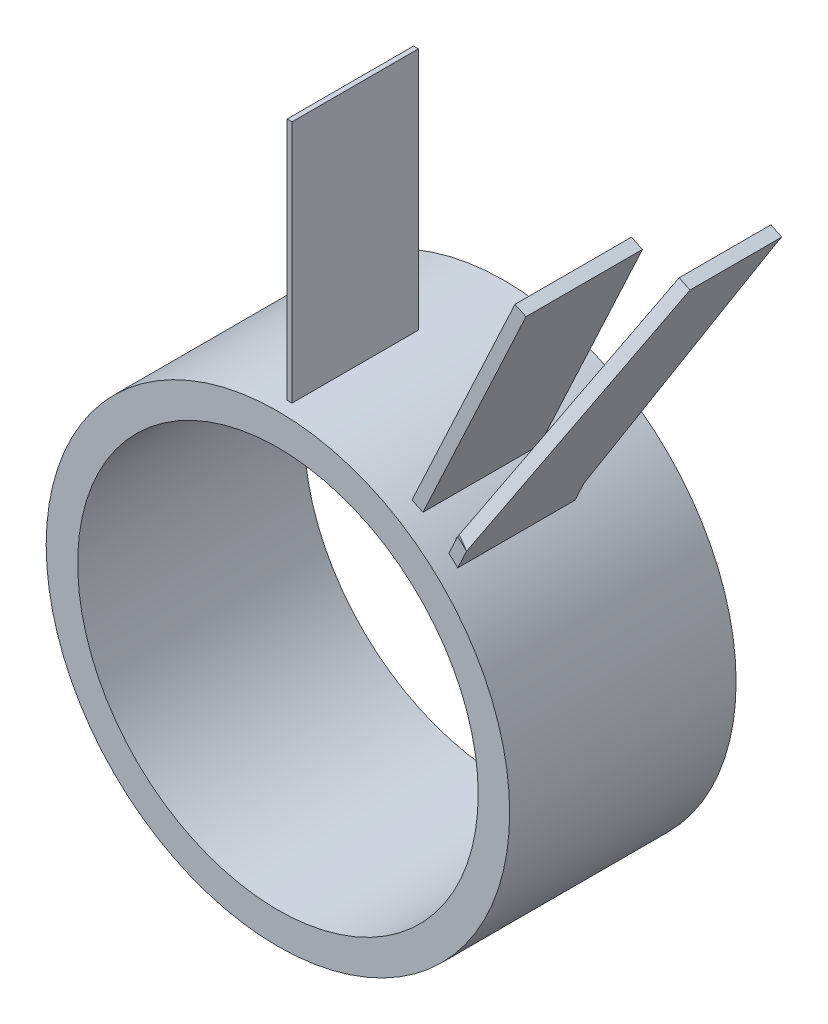
ISO-10303-21;
HEADER;
FILE_DESCRIPTION(('STEP AP214'),'2;1');
FILE_NAME('part.step','',(''),(''),'','','');
FILE_SCHEMA(('AUTOMOTIVE_DESIGN { 1 0 10303 214 1 1 1 1 }'));
ENDSEC;
DATA;
#1=APPLICATION_CONTEXT('core data for automotive mechanical design processes');
#2=APPLICATION_PROTOCOL_DEFINITION('international standard','automotive_design',2000,#1);
#3=PRODUCT_CONTEXT('',#1,'mechanical');
#4=PRODUCT('Part','Part','',(#3));
#5=PRODUCT_RELATED_PRODUCT_CATEGORY('part','',(#4));
#6=PRODUCT_DEFINITION_FORMATION('','',#4);
#7=PRODUCT_DEFINITION_CONTEXT('part definition',#1,'design');
#8=PRODUCT_DEFINITION('design','',#6,#7);
#9=PRODUCT_DEFINITION_SHAPE('','',#8);
#10=(LENGTH_UNIT() NAMED_UNIT(*) SI_UNIT(.MILLI.,.METRE.));
#11=(NAMED_UNIT(*) PLANE_ANGLE_UNIT() SI_UNIT($,.RADIAN.));
#12=(NAMED_UNIT(*) SI_UNIT($,.STERADIAN.) SOLID_ANGLE_UNIT());
#13=UNCERTAINTY_MEASURE_WITH_UNIT(LENGTH_MEASURE(1.E-05),#10,'distance_accuracy_value','');
#14=(GEOMETRIC_REPRESENTATION_CONTEXT(3) GLOBAL_UNCERTAINTY_ASSIGNED_CONTEXT((#13)) GLOBAL_UNIT_ASSIGNED_CONTEXT((#10,
#11,#12)) REPRESENTATION_CONTEXT('',''));
#15=CARTESIAN_POINT('',(0.,0.,0.));
#16=DIRECTION('',(0.,0.,1.));
#17=DIRECTION('',(1.,0.,0.));
#18=AXIS2_PLACEMENT_3D('',#15,#16,#17);
#19=CARTESIAN_POINT('',(31.951380435412,62.1925529718049,30.3912065094778));
#20=DIRECTION('',(0.,0.,-1.));
#21=DIRECTION('',(-1.,0.,0.));
#22=AXIS2_PLACEMENT_3D('',#19,#20,#21);
#23=PLANE('',#22);
#24=DIRECTION('',(0.906307787036648,-0.422618261740703,0.));
#25=VECTOR('',#24,1.);
#26=CARTESIAN_POINT('',(16.8157300094304,29.7340458868744,30.3912065094778));
#27=LINE('',#26,#25);
#28=CARTESIAN_POINT('',(16.8157300094304,29.7340458868744,30.3912065094778));
#29=VERTEX_POINT('',#28);
#30=CARTESIAN_POINT('',(18.4390169483902,28.9770947558545,30.3912065094778));
#31=VERTEX_POINT('',#30);
#32=EDGE_CURVE('E112',#29,#31,#27,.T.);
#33=ORIENTED_EDGE('',*,*,#32,.T.);
#34=DIRECTION('',(-0.422618261740703,-0.906307787036648,0.));
#35=VECTOR('',#34,1.);
#36=CARTESIAN_POINT('',(33.5746673743717,61.435601840785,30.3912065094778));
#37=LINE('',#36,#35);
#38=CARTESIAN_POINT('',(33.5746673743717,61.435601840785,30.3912065094778));
#39=VERTEX_POINT('',#38);
#40=EDGE_CURVE('E12',#39,#31,#37,.T.);
#41=ORIENTED_EDGE('',*,*,#40,.F.);
#42=DIRECTION('',(0.906307787036648,-0.422618261740703,0.));
#43=VECTOR('',#42,1.);
#44=CARTESIAN_POINT('',(31.951380435412,62.1925529718049,30.3912065094778));
#45=LINE('',#44,#43);
#46=CARTESIAN_POINT('',(31.951380435412,62.1925529718049,30.3912065094778));
#47=VERTEX_POINT('',#46);
#48=EDGE_CURVE('E100',#47,#39,#45,.T.);
#49=ORIENTED_EDGE('',*,*,#48,.F.);
#50=DIRECTION('',(-0.422618261740703,-0.906307787036648,0.));
#51=VECTOR('',#50,1.);
#52=CARTESIAN_POINT('',(31.951380435412,62.1925529718049,30.3912065094778));
#53=LINE('',#52,#51);
#54=EDGE_CURVE('E108',#47,#29,#53,.T.);
#55=ORIENTED_EDGE('',*,*,#54,.T.);
#56=EDGE_LOOP('',(#33,#41,#49,#55));
#57=FACE_BOUND('',#56,.T.);
#58=ADVANCED_FACE('F49',(#57),#23,.F.);
#59=CARTESIAN_POINT('',(33.5746673743717,61.435601840785,13.2772317859775));
#60=DIRECTION('',(-0.906307787036648,0.422618261740703,0.));
#61=DIRECTION('',(-0.422618261740703,-0.906307787036648,0.));
#62=AXIS2_PLACEMENT_3D('',#59,#60,#61);
#63=PLANE('',#62);
#64=DIRECTION('',(0.,0.,-1.));
#65=VECTOR('',#64,1.);
#66=CARTESIAN_POINT('',(18.4390169483902,28.9770947558545,13.2772317859775));
#67=LINE('',#66,#65);
#68=CARTESIAN_POINT('',(18.4390169483902,28.9770947558545,13.2772317859775));
#69=VERTEX_POINT('',#68);
#70=EDGE_CURVE('E104',#31,#69,#67,.T.);
#71=ORIENTED_EDGE('',*,*,#70,.T.);
#72=DIRECTION('',(-0.422618261740703,-0.906307787036648,0.));
#73=VECTOR('',#72,1.);
#74=CARTESIAN_POINT('',(33.5746673743717,61.435601840785,13.2772317859775));
#75=LINE('',#74,#73);
#76=CARTESIAN_POINT('',(33.5746673743717,61.435601840785,13.2772317859775));
#77=VERTEX_POINT('',#76);
#78=EDGE_CURVE('E57',#77,#69,#75,.T.);
#79=ORIENTED_EDGE('',*,*,#78,.F.);
#80=DIRECTION('',(0.,0.,-1.));
#81=VECTOR('',#80,1.);
#82=CARTESIAN_POINT('',(33.5746673743717,61.435601840785,13.2772317859775));
#83=LINE('',#82,#81);
#84=EDGE_CURVE('E95',#39,#77,#83,.T.);
#85=ORIENTED_EDGE('',*,*,#84,.F.);
#86=ORIENTED_EDGE('',*,*,#40,.T.);
#87=EDGE_LOOP('',(#71,#79,#85,#86));
#88=FACE_BOUND('',#87,.T.);
#89=ADVANCED_FACE('F103',(#88),#63,.F.);
#90=CARTESIAN_POINT('',(31.951380435412,62.1925529718049,13.2772317859775));
#91=DIRECTION('',(0.,0.,1.));
#92=DIRECTION('',(1.,0.,0.));
#93=AXIS2_PLACEMENT_3D('',#90,#91,#92);
#94=PLANE('',#93);
#95=DIRECTION('',(-0.906307787036648,0.422618261740703,0.));
#96=VECTOR('',#95,1.);
#97=CARTESIAN_POINT('',(16.8157300094304,29.7340458868744,13.2772317859775));
#98=LINE('',#97,#96);
#99=CARTESIAN_POINT('',(16.8157300094304,29.7340458868744,13.2772317859775));
#100=VERTEX_POINT('',#99);
#101=EDGE_CURVE('E82',#69,#100,#98,.T.);
#102=ORIENTED_EDGE('',*,*,#101,.T.);
#103=DIRECTION('',(-0.422618261740703,-0.906307787036648,0.));
#104=VECTOR('',#103,1.);
#105=CARTESIAN_POINT('',(31.951380435412,62.1925529718049,13.2772317859775));
#106=LINE('',#105,#104);
#107=CARTESIAN_POINT('',(31.951380435412,62.1925529718049,13.2772317859775));
#108=VERTEX_POINT('',#107);
#109=EDGE_CURVE('E105',#108,#100,#106,.T.);
#110=ORIENTED_EDGE('',*,*,#109,.F.);
#111=DIRECTION('',(-0.906307787036648,0.422618261740703,0.));
#112=VECTOR('',#111,1.);
#113=CARTESIAN_POINT('',(31.951380435412,62.1925529718049,13.2772317859775));
#114=LINE('',#113,#112);
#115=EDGE_CURVE('E98',#77,#108,#114,.T.);
#116=ORIENTED_EDGE('',*,*,#115,.F.);
#117=ORIENTED_EDGE('',*,*,#78,.T.);
#118=EDGE_LOOP('',(#102,#110,#116,#117));
#119=FACE_BOUND('',#118,.T.);
#120=ADVANCED_FACE('F106',(#119),#94,.F.);
#121=CARTESIAN_POINT('',(31.951380435412,62.1925529718049,13.2772317859775));
#122=DIRECTION('',(0.906307787036648,-0.422618261740703,0.));
#123=DIRECTION('',(0.422618261740703,0.906307787036648,0.));
#124=AXIS2_PLACEMENT_3D('',#121,#122,#123);
#125=PLANE('',#124);
#126=DIRECTION('',(0.,0.,1.));
#127=VECTOR('',#126,1.);
#128=CARTESIAN_POINT('',(16.8157300094304,29.7340458868744,13.2772317859775));
#129=LINE('',#128,#127);
#130=EDGE_CURVE('E88',#100,#29,#129,.T.);
#131=ORIENTED_EDGE('',*,*,#130,.T.);
#132=ORIENTED_EDGE('',*,*,#54,.F.);
#133=DIRECTION('',(0.,0.,1.));
#134=VECTOR('',#133,1.);
#135=CARTESIAN_POINT('',(31.951380435412,62.1925529718049,13.2772317859775));
#136=LINE('',#135,#134);
#137=EDGE_CURVE('E65',#108,#47,#136,.T.);
#138=ORIENTED_EDGE('',*,*,#137,.F.);
#139=ORIENTED_EDGE('',*,*,#109,.T.);
#140=EDGE_LOOP('',(#131,#132,#138,#139));
#141=FACE_BOUND('',#140,.T.);
#142=ADVANCED_FACE('F119',(#141),#125,.F.);
#143=CARTESIAN_POINT('',(29.5278442932913,63.3226664346912,0.));
#144=DIRECTION('',(-0.422618261740703,-0.906307787036648,0.));
#145=DIRECTION('',(0.906307787036648,-0.422618261740703,0.));
#146=AXIS2_PLACEMENT_3D('',#143,#144,#145);
#147=PLANE('',#146);
#148=ORIENTED_EDGE('',*,*,#48,.T.);
#149=ORIENTED_EDGE('',*,*,#84,.T.);
#150=ORIENTED_EDGE('',*,*,#115,.T.);
#151=ORIENTED_EDGE('',*,*,#137,.T.);
#152=EDGE_LOOP('',(#148,#149,#150,#151));
#153=FACE_BOUND('',#152,.T.);
#154=ADVANCED_FACE('F96',(#153),#147,.F.);
#155=CARTESIAN_POINT('',(14.3921938673098,30.8641593497607,0.));
#156=DIRECTION('',(-0.422618261740703,-0.906307787036648,0.));
#157=DIRECTION('',(0.906307787036648,-0.422618261740703,0.));
#158=AXIS2_PLACEMENT_3D('',#155,#156,#157);
#159=PLANE('',#158);
#160=ORIENTED_EDGE('',*,*,#32,.F.);
#161=ORIENTED_EDGE('',*,*,#130,.F.);
#162=ORIENTED_EDGE('',*,*,#101,.F.);
#163=ORIENTED_EDGE('',*,*,#70,.F.);
#164=EDGE_LOOP('',(#160,#161,#162,#163));
#165=FACE_BOUND('',#164,.T.);
#166=ADVANCED_FACE('F122',(#165),#159,.T.);
#167=CLOSED_SHELL('',(#58,#89,#120,#142,#154,#166));
#168=MANIFOLD_SOLID_BREP('B2',#167);
#169=CARTESIAN_POINT('',(22.3081755282439,25.7308546551161,33.274));
#170=DIRECTION('',(0.906307787036648,-0.422618261740703,0.));
#171=DIRECTION('',(0.422618261740703,0.906307787036648,0.));
#172=AXIS2_PLACEMENT_3D('',#169,#170,#171);
#173=PLANE('',#172);
#174=DIRECTION('',(0.,0.,-1.));
#175=VECTOR('',#174,1.);
#176=CARTESIAN_POINT('',(23.5963159900295,28.4932807900038,33.274));
#177=LINE('',#176,#175);
#178=CARTESIAN_POINT('',(23.5963159900296,28.4932807900038,30.4631719255646));
#179=VERTEX_POINT('',#178);
#180=CARTESIAN_POINT('',(23.5963159900295,28.4932807900038,30.1847156332697));
#181=VERTEX_POINT('',#180);
#182=EDGE_CURVE('E354',#179,#181,#177,.T.);
#183=ORIENTED_EDGE('',*,*,#182,.T.);
#184=DIRECTION('',(-0.374700535460135,-0.803547891412889,0.462504372878558));
#185=VECTOR('',#184,1.);
#186=CARTESIAN_POINT('',(22.0483470882728,25.173650767453,32.0954211657913));
#187=LINE('',#186,#185);
#188=CARTESIAN_POINT('',(23.3707230487655,28.009495166245,30.4631719255646));
#189=VERTEX_POINT('',#188);
#190=EDGE_CURVE('E47',#181,#189,#187,.T.);
#191=ORIENTED_EDGE('',*,*,#190,.T.);
#192=DIRECTION('',(0.422618261740703,0.906307787036648,0.));
#193=VECTOR('',#192,1.);
#194=CARTESIAN_POINT('',(22.3081755282439,25.7308546551161,30.4631719255646));
#195=LINE('',#194,#193);
#196=EDGE_CURVE('E359',#189,#179,#195,.T.);
#197=ORIENTED_EDGE('',*,*,#196,.T.);
#198=EDGE_LOOP('',(#183,#191,#197));
#199=FACE_BOUND('',#198,.T.);
#200=ADVANCED_FACE('F173',(#199),#173,.F.);
#201=CARTESIAN_POINT('',(0.,0.,33.274));
#202=DIRECTION('',(0.,0.,-1.));
#203=DIRECTION('',(-1.,0.,0.));
#204=AXIS2_PLACEMENT_3D('',#201,#202,#203);
#205=CYLINDRICAL_SURFACE('',#204,34.0548319138657);
#206=DIRECTION('',(0.,0.,-1.));
#207=VECTOR('',#206,1.);
#208=CARTESIAN_POINT('',(0.,34.0548319138657,33.274));
#209=LINE('',#208,#207);
#210=CARTESIAN_POINT('',(0.,34.0548319138657,31.2031803265018));
#211=VERTEX_POINT('',#210);
#212=CARTESIAN_POINT('',(0.,34.0548319138657,12.6239503703456));
#213=VERTEX_POINT('',#212);
#214=EDGE_CURVE('E182',#211,#213,#209,.T.);
#215=ORIENTED_EDGE('',*,*,#214,.F.);
#216=CARTESIAN_POINT('',(0.,0.,31.2031803265018));
#217=DIRECTION('',(0.,0.,-1.));
#218=DIRECTION('',(-1.,0.,0.));
#219=AXIS2_PLACEMENT_3D('',#216,#217,#218);
#220=CIRCLE('',#219,34.0548319138657);
#221=CARTESIAN_POINT('',(-0.720665424623235,34.0472057300948,31.2031803265018));
#222=VERTEX_POINT('',#221);
#223=EDGE_CURVE('E418',#222,#211,#220,.T.);
#224=ORIENTED_EDGE('',*,*,#223,.F.);
#225=DIRECTION('',(0.,0.,-1.));
#226=VECTOR('',#225,1.);
#227=CARTESIAN_POINT('',(-0.720665424623235,34.0472057300948,33.274));
#228=LINE('',#227,#226);
#229=CARTESIAN_POINT('',(-0.720665424623235,34.0472057300948,12.6239503703456));
#230=VERTEX_POINT('',#229);
#231=EDGE_CURVE('E425',#230,#222,#228,.F.);
#232=ORIENTED_EDGE('',*,*,#231,.F.);
#233=CARTESIAN_POINT('',(0.,0.,12.6239503703456));
#234=DIRECTION('',(0.,0.,1.));
#235=DIRECTION('',(1.,0.,0.));
#236=AXIS2_PLACEMENT_3D('',#233,#234,#235);
#237=CIRCLE('',#236,34.0548319138657);
#238=EDGE_CURVE('E429',#213,#230,#237,.T.);
#239=ORIENTED_EDGE('',*,*,#238,.F.);
#240=EDGE_LOOP('',(#215,#224,#232,#239));
#241=FACE_BOUND('',#240,.T.);
#242=CARTESIAN_POINT('',(0.,0.,33.274));
#243=DIRECTION('',(0.,0.,1.));
#244=DIRECTION('',(1.,0.,0.));
#245=AXIS2_PLACEMENT_3D('',#242,#243,#244);
#246=CIRCLE('',#245,34.0548319138657);
#247=CARTESIAN_POINT('',(34.0548319138657,0.,33.274));
#248=VERTEX_POINT('',#247);
#249=EDGE_CURVE('E414',#248,#248,#246,.T.);
#250=ORIENTED_EDGE('',*,*,#249,.F.);
#251=EDGE_LOOP('',(#250));
#252=FACE_BOUND('',#251,.T.);
#253=CARTESIAN_POINT('',(0.,0.,0.));
#254=DIRECTION('',(0.,0.,1.));
#255=DIRECTION('',(1.,0.,0.));
#256=AXIS2_PLACEMENT_3D('',#253,#254,#255);
#257=CIRCLE('',#256,34.0548319138657);
#258=CARTESIAN_POINT('',(34.0548319138657,0.,0.));
#259=VERTEX_POINT('',#258);
#260=EDGE_CURVE('E410',#259,#259,#257,.T.);
#261=ORIENTED_EDGE('',*,*,#260,.T.);
#262=EDGE_LOOP('',(#261));
#263=FACE_BOUND('',#262,.T.);
#264=CARTESIAN_POINT('',(0.,0.,30.4631719255646));
#265=DIRECTION('',(0.,0.,1.));
#266=DIRECTION('',(1.,0.,0.));
#267=AXIS2_PLACEMENT_3D('',#264,#265,#266);
#268=CIRCLE('',#267,34.0548319138657);
#269=CARTESIAN_POINT('',(23.6240402107343,24.5282755366792,30.4631719255646));
#270=VERTEX_POINT('',#269);
#271=CARTESIAN_POINT('',(22.3081755282439,25.7308546551161,30.4631719255646));
#272=VERTEX_POINT('',#271);
#273=EDGE_CURVE('E355',#270,#272,#268,.T.);
#274=ORIENTED_EDGE('',*,*,#273,.T.);
#275=DIRECTION('',(0.,0.,-1.));
#276=VECTOR('',#275,1.);
#277=CARTESIAN_POINT('',(22.3081755282439,25.7308546551161,33.274));
#278=LINE('',#277,#276);
#279=CARTESIAN_POINT('',(22.3081755282439,25.7308546551161,13.2424675865463));
#280=VERTEX_POINT('',#279);
#281=EDGE_CURVE('E350',#272,#280,#278,.T.);
#282=ORIENTED_EDGE('',*,*,#281,.T.);
#283=CARTESIAN_POINT('',(0.,0.,13.2424675865463));
#284=DIRECTION('',(0.,0.,-1.));
#285=DIRECTION('',(-1.,0.,0.));
#286=AXIS2_PLACEMENT_3D('',#283,#284,#285);
#287=CIRCLE('',#286,34.0548319138657);
#288=CARTESIAN_POINT('',(23.6240402107343,24.5282755366792,13.2424675865463));
#289=VERTEX_POINT('',#288);
#290=EDGE_CURVE('E345',#280,#289,#287,.T.);
#291=ORIENTED_EDGE('',*,*,#290,.T.);
#292=DIRECTION('',(0.,0.,-1.));
#293=VECTOR('',#292,1.);
#294=CARTESIAN_POINT('',(23.6240402107343,24.5282755366792,33.274));
#295=LINE('',#294,#293);
#296=EDGE_CURVE('E340',#270,#289,#295,.T.);
#297=ORIENTED_EDGE('',*,*,#296,.F.);
#298=EDGE_LOOP('',(#274,#282,#291,#297));
#299=FACE_BOUND('',#298,.T.);
#300=ADVANCED_FACE('F175',(#241,#252,#263,#299),#205,.T.);
#301=CARTESIAN_POINT('',(0.,0.,33.274));
#302=DIRECTION('',(0.,0.,1.));
#303=DIRECTION('',(1.,0.,0.));
#304=AXIS2_PLACEMENT_3D('',#301,#302,#303);
#305=PLANE('',#304);
#306=ORIENTED_EDGE('',*,*,#249,.T.);
#307=EDGE_LOOP('',(#306));
#308=FACE_BOUND('',#307,.T.);
#309=CARTESIAN_POINT('',(0.,0.,33.274));
#310=DIRECTION('',(0.,0.,1.));
#311=DIRECTION('',(1.,0.,0.));
#312=AXIS2_PLACEMENT_3D('',#309,#310,#311);
#313=CIRCLE('',#312,29.4319150885215);
#314=CARTESIAN_POINT('',(29.4319150885215,0.,33.274));
#315=VERTEX_POINT('',#314);
#316=EDGE_CURVE('E406',#315,#315,#313,.T.);
#317=ORIENTED_EDGE('',*,*,#316,.F.);
#318=EDGE_LOOP('',(#317));
#319=FACE_BOUND('',#318,.T.);
#320=ADVANCED_FACE('F469',(#308,#319),#305,.T.);
#321=CARTESIAN_POINT('',(0.,0.,0.));
#322=DIRECTION('',(0.,0.,1.));
#323=DIRECTION('',(1.,0.,0.));
#324=AXIS2_PLACEMENT_3D('',#321,#322,#323);
#325=PLANE('',#324);
#326=ORIENTED_EDGE('',*,*,#260,.F.);
#327=EDGE_LOOP('',(#326));
#328=FACE_BOUND('',#327,.T.);
#329=CARTESIAN_POINT('',(0.,0.,0.));
#330=DIRECTION('',(0.,0.,1.));
#331=DIRECTION('',(1.,0.,0.));
#332=AXIS2_PLACEMENT_3D('',#329,#330,#331);
#333=CIRCLE('',#332,29.4319150885215);
#334=CARTESIAN_POINT('',(29.4319150885215,0.,0.));
#335=VERTEX_POINT('',#334);
#336=EDGE_CURVE('E405',#335,#335,#333,.T.);
#337=ORIENTED_EDGE('',*,*,#336,.T.);
#338=EDGE_LOOP('',(#337));
#339=FACE_BOUND('',#338,.T.);
#340=ADVANCED_FACE('F615',(#328,#339),#325,.F.);
#341=CARTESIAN_POINT('',(0.,0.,33.274));
#342=DIRECTION('',(0.,0.,-1.));
#343=DIRECTION('',(-1.,0.,0.));
#344=AXIS2_PLACEMENT_3D('',#341,#342,#343);
#345=CYLINDRICAL_SURFACE('',#344,29.4319150885215);
#346=ORIENTED_EDGE('',*,*,#316,.T.);
#347=EDGE_LOOP('',(#346));
#348=FACE_BOUND('',#347,.T.);
#349=ORIENTED_EDGE('',*,*,#336,.F.);
#350=EDGE_LOOP('',(#349));
#351=FACE_BOUND('',#350,.T.);
#352=ADVANCED_FACE('F460',(#348,#351),#345,.F.);
#353=CARTESIAN_POINT('',(0.,69.85,31.2031803265018));
#354=DIRECTION('',(-1.,0.,0.));
#355=DIRECTION('',(0.,0.,1.));
#356=AXIS2_PLACEMENT_3D('',#353,#354,#355);
#357=PLANE('',#356);
#358=DIRECTION('',(0.,-1.,0.));
#359=VECTOR('',#358,1.);
#360=CARTESIAN_POINT('',(0.,69.85,31.2031803265018));
#361=LINE('',#360,#359);
#362=CARTESIAN_POINT('',(0.,69.85,31.2031803265018));
#363=VERTEX_POINT('',#362);
#364=EDGE_CURVE('E389',#363,#211,#361,.T.);
#365=ORIENTED_EDGE('',*,*,#364,.T.);
#366=ORIENTED_EDGE('',*,*,#214,.T.);
#367=DIRECTION('',(0.,-1.,0.));
#368=VECTOR('',#367,1.);
#369=CARTESIAN_POINT('',(0.,69.85,12.6239503703456));
#370=LINE('',#369,#368);
#371=CARTESIAN_POINT('',(0.,69.85,12.6239503703456));
#372=VERTEX_POINT('',#371);
#373=EDGE_CURVE('E401',#372,#213,#370,.T.);
#374=ORIENTED_EDGE('',*,*,#373,.F.);
#375=DIRECTION('',(0.,0.,-1.));
#376=VECTOR('',#375,1.);
#377=CARTESIAN_POINT('',(0.,69.85,31.2031803265018));
#378=LINE('',#377,#376);
#379=EDGE_CURVE('E343',#363,#372,#378,.T.);
#380=ORIENTED_EDGE('',*,*,#379,.F.);
#381=EDGE_LOOP('',(#365,#366,#374,#380));
#382=FACE_BOUND('',#381,.T.);
#383=ADVANCED_FACE('F436',(#382),#357,.F.);
#384=CARTESIAN_POINT('',(-0.720665424623235,69.85,31.2031803265018));
#385=DIRECTION('',(1.,0.,0.));
#386=DIRECTION('',(0.,0.,-1.));
#387=AXIS2_PLACEMENT_3D('',#384,#385,#386);
#388=PLANE('',#387);
#389=DIRECTION('',(0.,-1.,0.));
#390=VECTOR('',#389,1.);
#391=CARTESIAN_POINT('',(-0.720665424623235,69.85,12.6239503703456));
#392=LINE('',#391,#390);
#393=CARTESIAN_POINT('',(-0.720665424623235,69.85,12.6239503703456));
#394=VERTEX_POINT('',#393);
#395=EDGE_CURVE('E397',#394,#230,#392,.T.);
#396=ORIENTED_EDGE('',*,*,#395,.T.);
#397=ORIENTED_EDGE('',*,*,#231,.T.);
#398=DIRECTION('',(0.,-1.,0.));
#399=VECTOR('',#398,1.);
#400=CARTESIAN_POINT('',(-0.720665424623235,69.85,31.2031803265018));
#401=LINE('',#400,#399);
#402=CARTESIAN_POINT('',(-0.720665424623235,69.85,31.2031803265018));
#403=VERTEX_POINT('',#402);
#404=EDGE_CURVE('E393',#403,#222,#401,.T.);
#405=ORIENTED_EDGE('',*,*,#404,.F.);
#406=DIRECTION('',(0.,0.,1.));
#407=VECTOR('',#406,1.);
#408=CARTESIAN_POINT('',(-0.720665424623235,69.85,31.2031803265018));
#409=LINE('',#408,#407);
#410=EDGE_CURVE('E383',#394,#403,#409,.T.);
#411=ORIENTED_EDGE('',*,*,#410,.F.);
#412=EDGE_LOOP('',(#396,#397,#405,#411));
#413=FACE_BOUND('',#412,.T.);
#414=ADVANCED_FACE('F452',(#413),#388,.F.);
#415=CARTESIAN_POINT('',(-0.720665424623235,69.85,12.6239503703456));
#416=DIRECTION('',(0.,0.,1.));
#417=DIRECTION('',(1.,0.,0.));
#418=AXIS2_PLACEMENT_3D('',#415,#416,#417);
#419=PLANE('',#418);
#420=ORIENTED_EDGE('',*,*,#373,.T.);
#421=ORIENTED_EDGE('',*,*,#238,.T.);
#422=ORIENTED_EDGE('',*,*,#395,.F.);
#423=DIRECTION('',(-1.,0.,0.));
#424=VECTOR('',#423,1.);
#425=CARTESIAN_POINT('',(-0.720665424623235,69.85,12.6239503703456));
#426=LINE('',#425,#424);
#427=EDGE_CURVE('E380',#372,#394,#426,.T.);
#428=ORIENTED_EDGE('',*,*,#427,.F.);
#429=EDGE_LOOP('',(#420,#421,#422,#428));
#430=FACE_BOUND('',#429,.T.);
#431=ADVANCED_FACE('F441',(#430),#419,.F.);
#432=CARTESIAN_POINT('',(-0.720665424623235,69.85,31.2031803265018));
#433=DIRECTION('',(0.,0.,-1.));
#434=DIRECTION('',(-1.,0.,0.));
#435=AXIS2_PLACEMENT_3D('',#432,#433,#434);
#436=PLANE('',#435);
#437=ORIENTED_EDGE('',*,*,#404,.T.);
#438=ORIENTED_EDGE('',*,*,#223,.T.);
#439=ORIENTED_EDGE('',*,*,#364,.F.);
#440=DIRECTION('',(1.,0.,0.));
#441=VECTOR('',#440,1.);
#442=CARTESIAN_POINT('',(-0.720665424623235,69.85,31.2031803265018));
#443=LINE('',#442,#441);
#444=EDGE_CURVE('E386',#403,#363,#443,.T.);
#445=ORIENTED_EDGE('',*,*,#444,.F.);
#446=EDGE_LOOP('',(#437,#438,#439,#445));
#447=FACE_BOUND('',#446,.T.);
#448=ADVANCED_FACE('F449',(#447),#436,.F.);
#449=CARTESIAN_POINT('',(0.,69.85,0.));
#450=DIRECTION('',(0.,-1.,0.));
#451=DIRECTION('',(0.,0.,-1.));
#452=AXIS2_PLACEMENT_3D('',#449,#450,#451);
#453=PLANE('',#452);
#454=ORIENTED_EDGE('',*,*,#379,.T.);
#455=ORIENTED_EDGE('',*,*,#427,.T.);
#456=ORIENTED_EDGE('',*,*,#410,.T.);
#457=ORIENTED_EDGE('',*,*,#444,.T.);
#458=EDGE_LOOP('',(#454,#455,#456,#457));
#459=FACE_BOUND('',#458,.T.);
#460=ADVANCED_FACE('F445',(#459),#453,.F.);
#461=CARTESIAN_POINT('',(1.28814046178567,2.76242613488771,33.274));
#462=DIRECTION('',(0.,0.,-1.));
#463=DIRECTION('',(-1.,0.,0.));
#464=AXIS2_PLACEMENT_3D('',#461,#462,#463);
#465=CYLINDRICAL_SURFACE('',#464,34.0548319138657);
#466=CARTESIAN_POINT('',(1.28814046178567,2.76242613488771,30.4631719255646));
#467=DIRECTION('',(0.,0.,1.));
#468=DIRECTION('',(1.,0.,0.));
#469=AXIS2_PLACEMENT_3D('',#466,#467,#468);
#470=CIRCLE('',#469,34.0548319138657);
#471=CARTESIAN_POINT('',(24.91218067252,27.2907016715669,30.4631719255646));
#472=VERTEX_POINT('',#471);
#473=EDGE_CURVE('E339',#472,#179,#470,.T.);
#474=ORIENTED_EDGE('',*,*,#473,.F.);
#475=CARTESIAN_POINT('',(1.28814046178567,2.76242613488771,47.2676888790477));
#476=DIRECTION('',(0.19546279411341,0.419171314678339,0.886617000213853));
#477=DIRECTION('',(0.374700535460135,0.803547891412889,-0.462504372878559));
#478=AXIS2_PLACEMENT_3D('',#475,#476,#477);
#479=ELLIPSE('',#478,38.4098566863163,34.0548319138657);
#480=EDGE_CURVE('E195',#472,#181,#479,.T.);
#481=ORIENTED_EDGE('',*,*,#480,.T.);
#482=ORIENTED_EDGE('',*,*,#182,.F.);
#483=EDGE_LOOP('',(#474,#481,#482));
#484=FACE_BOUND('',#483,.T.);
#485=ADVANCED_FACE('F482',(#484),#465,.T.);
#486=CARTESIAN_POINT('',(22.3081755282439,25.7308546551161,30.4631719255646));
#487=DIRECTION('',(0.,0.,-1.));
#488=DIRECTION('',(-1.,0.,0.));
#489=AXIS2_PLACEMENT_3D('',#486,#487,#488);
#490=PLANE('',#489);
#491=DIRECTION('',(0.422618261740703,0.906307787036648,0.));
#492=VECTOR('',#491,1.);
#493=CARTESIAN_POINT('',(23.6240402107343,24.5282755366792,30.4631719255646));
#494=LINE('',#493,#492);
#495=EDGE_CURVE('E360',#270,#472,#494,.T.);
#496=ORIENTED_EDGE('',*,*,#495,.T.);
#497=ORIENTED_EDGE('',*,*,#473,.T.);
#498=ORIENTED_EDGE('',*,*,#196,.F.);
#499=EDGE_CURVE('E363',#272,#189,#195,.T.);
#500=ORIENTED_EDGE('',*,*,#499,.F.);
#501=ORIENTED_EDGE('',*,*,#273,.F.);
#502=EDGE_LOOP('',(#496,#497,#498,#500,#501));
#503=FACE_BOUND('',#502,.T.);
#504=ADVANCED_FACE('F474',(#503),#490,.F.);
#505=ORIENTED_EDGE('',*,*,#499,.T.);
#506=DIRECTION('',(0.,0.,-1.));
#507=VECTOR('',#506,1.);
#508=CARTESIAN_POINT('',(23.3707230487655,28.009495166245,33.274));
#509=LINE('',#508,#507);
#510=CARTESIAN_POINT('',(23.3707230487655,28.009495166245,13.2424675865463));
#511=VERTEX_POINT('',#510);
#512=EDGE_CURVE('E275',#189,#511,#509,.T.);
#513=ORIENTED_EDGE('',*,*,#512,.T.);
#514=DIRECTION('',(0.422618261740703,0.906307787036648,0.));
#515=VECTOR('',#514,1.);
#516=CARTESIAN_POINT('',(22.3081755282439,25.7308546551161,13.2424675865463));
#517=LINE('',#516,#515);
#518=EDGE_CURVE('E349',#280,#511,#517,.T.);
#519=ORIENTED_EDGE('',*,*,#518,.F.);
#520=ORIENTED_EDGE('',*,*,#281,.F.);
#521=EDGE_LOOP('',(#505,#513,#519,#520));
#522=FACE_BOUND('',#521,.T.);
#523=ADVANCED_FACE('F465',(#522),#173,.F.);
#524=CARTESIAN_POINT('',(23.6240402107343,24.5282755366792,13.2424675865463));
#525=DIRECTION('',(0.,0.,1.));
#526=DIRECTION('',(1.,0.,0.));
#527=AXIS2_PLACEMENT_3D('',#524,#525,#526);
#528=PLANE('',#527);
#529=ORIENTED_EDGE('',*,*,#518,.T.);
#530=DIRECTION('',(0.906307787036648,-0.422618261740703,0.));
#531=VECTOR('',#530,1.);
#532=CARTESIAN_POINT('',(23.3007654271688,28.0421169409419,13.2424675865463));
#533=LINE('',#532,#531);
#534=CARTESIAN_POINT('',(24.91218067252,27.2907016715669,13.2424675865463));
#535=VERTEX_POINT('',#534);
#536=EDGE_CURVE('E279',#511,#535,#533,.T.);
#537=ORIENTED_EDGE('',*,*,#536,.T.);
#538=DIRECTION('',(0.422618261740703,0.906307787036648,0.));
#539=VECTOR('',#538,1.);
#540=CARTESIAN_POINT('',(23.6240402107343,24.5282755366792,13.2424675865463));
#541=LINE('',#540,#539);
#542=EDGE_CURVE('E344',#289,#535,#541,.T.);
#543=ORIENTED_EDGE('',*,*,#542,.F.);
#544=ORIENTED_EDGE('',*,*,#290,.F.);
#545=EDGE_LOOP('',(#529,#537,#543,#544));
#546=FACE_BOUND('',#545,.T.);
#547=ADVANCED_FACE('F473',(#546),#528,.F.);
#548=CARTESIAN_POINT('',(23.6240402107343,24.5282755366792,33.274));
#549=DIRECTION('',(0.906307787036648,-0.422618261740703,0.));
#550=DIRECTION('',(0.422618261740703,0.906307787036648,0.));
#551=AXIS2_PLACEMENT_3D('',#548,#549,#550);
#552=PLANE('',#551);
#553=ORIENTED_EDGE('',*,*,#542,.T.);
#554=DIRECTION('',(0.391026872252347,0.838559833650355,-0.3793618201201));
#555=VECTOR('',#554,1.);
#556=CARTESIAN_POINT('',(24.91218067252,27.2907016715669,13.2424675865463));
#557=LINE('',#556,#555);
#558=CARTESIAN_POINT('',(39.1292792099329,57.7793678746148,-0.550508704093733));
#559=VERTEX_POINT('',#558);
#560=EDGE_CURVE('E317',#535,#559,#557,.T.);
#561=ORIENTED_EDGE('',*,*,#560,.T.);
#562=DIRECTION('',(0.372103165763745,0.79797781412384,-0.474099823027531));
#563=VECTOR('',#562,1.);
#564=CARTESIAN_POINT('',(39.6103362296122,58.8109979824767,-1.16342756337828));
#565=LINE('',#564,#563);
#566=CARTESIAN_POINT('',(39.6103362296122,58.8109979824767,-1.16342756337828));
#567=VERTEX_POINT('',#566);
#568=EDGE_CURVE('E302',#559,#567,#565,.T.);
#569=ORIENTED_EDGE('',*,*,#568,.T.);
#570=DIRECTION('',(0.,0.,1.));
#571=VECTOR('',#570,1.);
#572=CARTESIAN_POINT('',(39.6103362296122,58.8109979824767,12.3207873408817));
#573=LINE('',#572,#571);
#574=CARTESIAN_POINT('',(39.6103362296122,58.8109979824767,12.3207873408817));
#575=VERTEX_POINT('',#574);
#576=EDGE_CURVE('E298',#567,#575,#573,.T.);
#577=ORIENTED_EDGE('',*,*,#576,.T.);
#578=DIRECTION('',(-0.374700535460135,-0.803547891412889,0.462504372878558));
#579=VECTOR('',#578,1.);
#580=CARTESIAN_POINT('',(24.91218067252,27.2907016715669,30.4631719255646));
#581=LINE('',#580,#579);
#582=EDGE_CURVE('E313',#575,#472,#581,.T.);
#583=ORIENTED_EDGE('',*,*,#582,.T.);
#584=ORIENTED_EDGE('',*,*,#495,.F.);
#585=ORIENTED_EDGE('',*,*,#296,.T.);
#586=EDGE_LOOP('',(#553,#561,#569,#577,#583,#584,#585));
#587=FACE_BOUND('',#586,.T.);
#588=ADVANCED_FACE('F480',(#587),#552,.T.);
#589=CARTESIAN_POINT('',(23.3007654271688,28.0421169409419,30.4631719255646));
#590=DIRECTION('',(0.19546279411341,0.419171314678339,0.886617000213853));
#591=DIRECTION('',(0.,-0.904055214969321,0.427415685588134));
#592=AXIS2_PLACEMENT_3D('',#589,#590,#591);
#593=PLANE('',#592);
#594=ORIENTED_EDGE('',*,*,#480,.F.);
#595=ORIENTED_EDGE('',*,*,#582,.F.);
#596=DIRECTION('',(0.906307787036648,-0.422618261740703,0.));
#597=VECTOR('',#596,1.);
#598=CARTESIAN_POINT('',(37.998920984261,59.5624132518517,12.3207873408817));
#599=LINE('',#598,#597);
#600=CARTESIAN_POINT('',(37.998920984261,59.5624132518517,12.3207873408817));
#601=VERTEX_POINT('',#600);
#602=EDGE_CURVE('E296',#601,#575,#599,.T.);
#603=ORIENTED_EDGE('',*,*,#602,.F.);
#604=DIRECTION('',(-0.374700535460135,-0.803547891412889,0.462504372878558));
#605=VECTOR('',#604,1.);
#606=CARTESIAN_POINT('',(23.3007654271688,28.0421169409419,30.4631719255646));
#607=LINE('',#606,#605);
#608=CARTESIAN_POINT('',(23.3007654271688,28.0421169409419,30.4631719255646));
#609=VERTEX_POINT('',#608);
#610=EDGE_CURVE('E287',#601,#609,#607,.T.);
#611=ORIENTED_EDGE('',*,*,#610,.T.);
#612=DIRECTION('',(0.906307787036648,-0.422618261740703,0.));
#613=VECTOR('',#612,1.);
#614=CARTESIAN_POINT('',(23.3007654271688,28.0421169409419,30.4631719255646));
#615=LINE('',#614,#613);
#616=EDGE_CURVE('E270',#609,#189,#615,.T.);
#617=ORIENTED_EDGE('',*,*,#616,.T.);
#618=ORIENTED_EDGE('',*,*,#190,.F.);
#619=EDGE_LOOP('',(#594,#595,#603,#611,#617,#618));
#620=FACE_BOUND('',#619,.T.);
#621=ADVANCED_FACE('F294',(#620),#593,.T.);
#622=CARTESIAN_POINT('',(23.3007654271688,28.0421169409419,30.4631719255646));
#623=DIRECTION('',(-0.422618261740703,-0.906307787036648,0.));
#624=DIRECTION('',(0.906307787036648,-0.422618261740703,0.));
#625=AXIS2_PLACEMENT_3D('',#622,#623,#624);
#626=PLANE('',#625);
#627=ORIENTED_EDGE('',*,*,#512,.F.);
#628=ORIENTED_EDGE('',*,*,#616,.F.);
#629=DIRECTION('',(0.,0.,-1.));
#630=VECTOR('',#629,1.);
#631=CARTESIAN_POINT('',(23.3007654271688,28.0421169409419,30.4631719255646));
#632=LINE('',#631,#630);
#633=CARTESIAN_POINT('',(23.3007654271688,28.0421169409419,13.2424675865463));
#634=VERTEX_POINT('',#633);
#635=EDGE_CURVE('E274',#609,#634,#632,.T.);
#636=ORIENTED_EDGE('',*,*,#635,.T.);
#637=EDGE_CURVE('E332',#634,#511,#533,.T.);
#638=ORIENTED_EDGE('',*,*,#637,.T.);
#639=EDGE_LOOP('',(#627,#628,#636,#638));
#640=FACE_BOUND('',#639,.T.);
#641=ADVANCED_FACE('F272',(#640),#626,.T.);
#642=CARTESIAN_POINT('',(37.998920984261,59.5624132518517,12.3207873408817));
#643=DIRECTION('',(0.422618261740703,0.906307787036648,0.));
#644=DIRECTION('',(-0.906307787036648,0.422618261740703,0.));
#645=AXIS2_PLACEMENT_3D('',#642,#643,#644);
#646=PLANE('',#645);
#647=ORIENTED_EDGE('',*,*,#576,.F.);
#648=DIRECTION('',(0.906307787036648,-0.422618261740703,0.));
#649=VECTOR('',#648,1.);
#650=CARTESIAN_POINT('',(37.998920984261,59.5624132518517,-1.16342756337828));
#651=LINE('',#650,#649);
#652=CARTESIAN_POINT('',(37.998920984261,59.5624132518517,-1.16342756337828));
#653=VERTEX_POINT('',#652);
#654=EDGE_CURVE('E326',#653,#567,#651,.T.);
#655=ORIENTED_EDGE('',*,*,#654,.F.);
#656=DIRECTION('',(0.,0.,1.));
#657=VECTOR('',#656,1.);
#658=CARTESIAN_POINT('',(37.998920984261,59.5624132518517,12.3207873408817));
#659=LINE('',#658,#657);
#660=EDGE_CURVE('E280',#653,#601,#659,.T.);
#661=ORIENTED_EDGE('',*,*,#660,.T.);
#662=ORIENTED_EDGE('',*,*,#602,.T.);
#663=EDGE_LOOP('',(#647,#655,#661,#662));
#664=FACE_BOUND('',#663,.T.);
#665=ADVANCED_FACE('F501',(#664),#646,.T.);
#666=CARTESIAN_POINT('',(37.998920984261,59.5624132518517,-1.16342756337828));
#667=DIRECTION('',(-0.20036324309947,-0.429680361442548,-0.880471099926206));
#668=DIRECTION('',(0.,0.898695127041323,-0.438573903273074));
#669=AXIS2_PLACEMENT_3D('',#666,#667,#668);
#670=PLANE('',#669);
#671=ORIENTED_EDGE('',*,*,#568,.F.);
#672=DIRECTION('',(0.906307787036648,-0.422618261740703,0.));
#673=VECTOR('',#672,1.);
#674=CARTESIAN_POINT('',(37.5178639645817,58.5307831439898,-0.550508704093733));
#675=LINE('',#674,#673);
#676=CARTESIAN_POINT('',(37.5178639645817,58.5307831439898,-0.550508704093733));
#677=VERTEX_POINT('',#676);
#678=EDGE_CURVE('E329',#677,#559,#675,.T.);
#679=ORIENTED_EDGE('',*,*,#678,.F.);
#680=DIRECTION('',(0.372103165763745,0.79797781412384,-0.474099823027531));
#681=VECTOR('',#680,1.);
#682=CARTESIAN_POINT('',(37.998920984261,59.5624132518517,-1.16342756337828));
#683=LINE('',#682,#681);
#684=EDGE_CURVE('E307',#677,#653,#683,.T.);
#685=ORIENTED_EDGE('',*,*,#684,.T.);
#686=ORIENTED_EDGE('',*,*,#654,.T.);
#687=EDGE_LOOP('',(#671,#679,#685,#686));
#688=FACE_BOUND('',#687,.T.);
#689=ADVANCED_FACE('F502',(#688),#670,.T.);
#690=CARTESIAN_POINT('',(23.3007654271688,28.0421169409419,13.2424675865463));
#691=DIRECTION('',(-0.160325232989946,-0.343818571679243,-0.925248404178664));
#692=DIRECTION('',(0.,0.937374047138187,-0.348324411650657));
#693=AXIS2_PLACEMENT_3D('',#690,#691,#692);
#694=PLANE('',#693);
#695=ORIENTED_EDGE('',*,*,#560,.F.);
#696=ORIENTED_EDGE('',*,*,#536,.F.);
#697=ORIENTED_EDGE('',*,*,#637,.F.);
#698=DIRECTION('',(0.391026872252347,0.838559833650355,-0.3793618201201));
#699=VECTOR('',#698,1.);
#700=CARTESIAN_POINT('',(23.3007654271688,28.0421169409419,13.2424675865463));
#701=LINE('',#700,#699);
#702=EDGE_CURVE('E291',#634,#677,#701,.T.);
#703=ORIENTED_EDGE('',*,*,#702,.T.);
#704=ORIENTED_EDGE('',*,*,#678,.T.);
#705=EDGE_LOOP('',(#695,#696,#697,#703,#704));
#706=FACE_BOUND('',#705,.T.);
#707=ADVANCED_FACE('F496',(#706),#694,.T.);
#708=CARTESIAN_POINT('',(8.39835044203203,-3.916215126989,0.));
#709=DIRECTION('',(-0.906307787036648,0.422618261740703,0.));
#710=DIRECTION('',(-0.422618261740703,-0.906307787036648,0.));
#711=AXIS2_PLACEMENT_3D('',#708,#709,#710);
#712=PLANE('',#711);
#713=ORIENTED_EDGE('',*,*,#610,.F.);
#714=ORIENTED_EDGE('',*,*,#660,.F.);
#715=ORIENTED_EDGE('',*,*,#684,.F.);
#716=ORIENTED_EDGE('',*,*,#702,.F.);
#717=ORIENTED_EDGE('',*,*,#635,.F.);
#718=EDGE_LOOP('',(#713,#714,#715,#716,#717));
#719=FACE_BOUND('',#718,.T.);
#720=ADVANCED_FACE('F285',(#719),#712,.T.);
#721=CLOSED_SHELL('',(#200,#300,#320,#340,#352,#383,#414,#431,#448,#460,#485,#504,#523,#547,
#588,#621,#641,#665,#689,#707,#720));
#722=MANIFOLD_SOLID_BREP('B6',#721);
#723=ADVANCED_BREP_SHAPE_REPRESENTATION('',(#18,#168,#722),#14);
#724=SHAPE_DEFINITION_REPRESENTATION(#9,#723);
ENDSEC;
END-ISO-10303-21;
